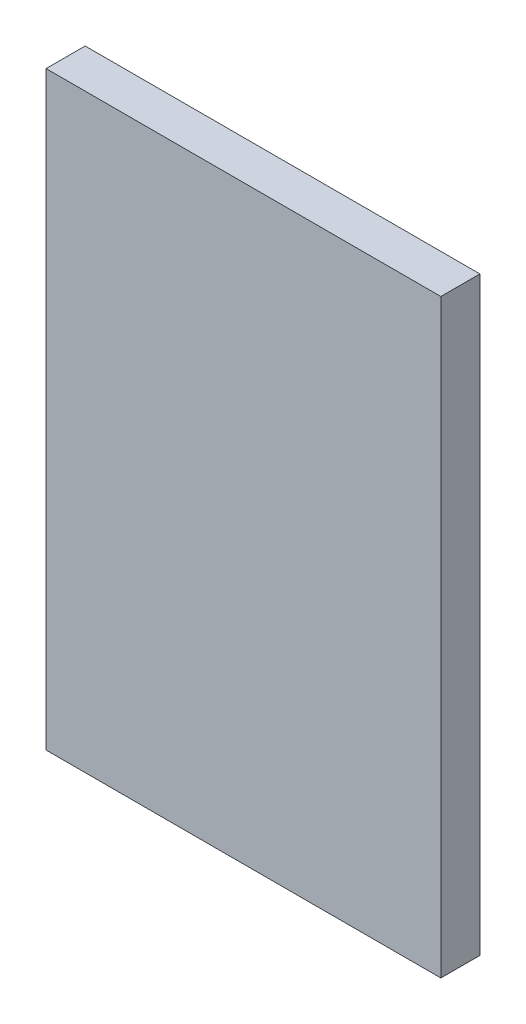
ISO-10303-21;
HEADER;
FILE_DESCRIPTION(('STEP AP214'),'2;1');
FILE_NAME('part.step','',(''),(''),'','','');
FILE_SCHEMA(('AUTOMOTIVE_DESIGN { 1 0 10303 214 1 1 1 1 }'));
ENDSEC;
DATA;
#1=APPLICATION_CONTEXT('core data for automotive mechanical design processes');
#2=APPLICATION_PROTOCOL_DEFINITION('international standard','automotive_design',2000,#1);
#3=PRODUCT_CONTEXT('',#1,'mechanical');
#4=PRODUCT('Part','Part','',(#3));
#5=PRODUCT_RELATED_PRODUCT_CATEGORY('part','',(#4));
#6=PRODUCT_DEFINITION_FORMATION('','',#4);
#7=PRODUCT_DEFINITION_CONTEXT('part definition',#1,'design');
#8=PRODUCT_DEFINITION('design','',#6,#7);
#9=PRODUCT_DEFINITION_SHAPE('','',#8);
#10=(LENGTH_UNIT() NAMED_UNIT(*) SI_UNIT(.MILLI.,.METRE.));
#11=(NAMED_UNIT(*) PLANE_ANGLE_UNIT() SI_UNIT($,.RADIAN.));
#12=(NAMED_UNIT(*) SI_UNIT($,.STERADIAN.) SOLID_ANGLE_UNIT());
#13=UNCERTAINTY_MEASURE_WITH_UNIT(LENGTH_MEASURE(1.E-05),#10,'distance_accuracy_value','');
#14=(GEOMETRIC_REPRESENTATION_CONTEXT(3) GLOBAL_UNCERTAINTY_ASSIGNED_CONTEXT((#13)) GLOBAL_UNIT_ASSIGNED_CONTEXT((#10,
#11,#12)) REPRESENTATION_CONTEXT('',''));
#15=CARTESIAN_POINT('',(0.,0.,0.));
#16=DIRECTION('',(0.,0.,1.));
#17=DIRECTION('',(1.,0.,0.));
#18=AXIS2_PLACEMENT_3D('',#15,#16,#17);
#19=CARTESIAN_POINT('',(0.,0.,1.));
#20=DIRECTION('',(0.,0.,1.));
#21=DIRECTION('',(1.,0.,0.));
#22=AXIS2_PLACEMENT_3D('',#19,#20,#21);
#23=PLANE('',#22);
#24=DIRECTION('',(1.,0.,0.));
#25=VECTOR('',#24,1.);
#26=CARTESIAN_POINT('',(5.05,7.55,1.));
#27=LINE('',#26,#25);
#28=CARTESIAN_POINT('',(-5.05,7.55,1.));
#29=VERTEX_POINT('',#28);
#30=CARTESIAN_POINT('',(5.05,7.55,1.));
#31=VERTEX_POINT('',#30);
#32=EDGE_CURVE('E68',#29,#31,#27,.T.);
#33=ORIENTED_EDGE('',*,*,#32,.F.);
#34=DIRECTION('',(0.,1.,0.));
#35=VECTOR('',#34,1.);
#36=CARTESIAN_POINT('',(-5.05,7.55,1.));
#37=LINE('',#36,#35);
#38=CARTESIAN_POINT('',(-5.05,-7.55,1.));
#39=VERTEX_POINT('',#38);
#40=EDGE_CURVE('E20',#39,#29,#37,.T.);
#41=ORIENTED_EDGE('',*,*,#40,.F.);
#42=DIRECTION('',(1.,0.,0.));
#43=VECTOR('',#42,1.);
#44=CARTESIAN_POINT('',(-5.05,-7.55,1.));
#45=LINE('',#44,#43);
#46=CARTESIAN_POINT('',(5.05,-7.55,1.));
#47=VERTEX_POINT('',#46);
#48=EDGE_CURVE('E58',#47,#39,#45,.F.);
#49=ORIENTED_EDGE('',*,*,#48,.F.);
#50=DIRECTION('',(0.,1.,0.));
#51=VECTOR('',#50,1.);
#52=CARTESIAN_POINT('',(5.05,-7.55,1.));
#53=LINE('',#52,#51);
#54=EDGE_CURVE('E53',#31,#47,#53,.F.);
#55=ORIENTED_EDGE('',*,*,#54,.F.);
#56=EDGE_LOOP('',(#33,#41,#49,#55));
#57=FACE_BOUND('',#56,.T.);
#58=ADVANCED_FACE('F17',(#57),#23,.T.);
#59=CARTESIAN_POINT('',(-5.05,7.55,0.));
#60=DIRECTION('',(-1.,0.,0.));
#61=DIRECTION('',(0.,0.,1.));
#62=AXIS2_PLACEMENT_3D('',#59,#60,#61);
#63=PLANE('',#62);
#64=DIRECTION('',(0.,0.,1.));
#65=VECTOR('',#64,1.);
#66=CARTESIAN_POINT('',(-5.05,7.55,0.));
#67=LINE('',#66,#65);
#68=CARTESIAN_POINT('',(-5.05,7.55,0.));
#69=VERTEX_POINT('',#68);
#70=EDGE_CURVE('E79',#69,#29,#67,.T.);
#71=ORIENTED_EDGE('',*,*,#70,.F.);
#72=DIRECTION('',(0.,1.,0.));
#73=VECTOR('',#72,1.);
#74=CARTESIAN_POINT('',(-5.05,0.,0.));
#75=LINE('',#74,#73);
#76=CARTESIAN_POINT('',(-5.05,-7.55,0.));
#77=VERTEX_POINT('',#76);
#78=EDGE_CURVE('E74',#69,#77,#75,.F.);
#79=ORIENTED_EDGE('',*,*,#78,.T.);
#80=DIRECTION('',(0.,0.,-1.));
#81=VECTOR('',#80,1.);
#82=CARTESIAN_POINT('',(-5.05,-7.55,0.));
#83=LINE('',#82,#81);
#84=EDGE_CURVE('E63',#39,#77,#83,.T.);
#85=ORIENTED_EDGE('',*,*,#84,.F.);
#86=ORIENTED_EDGE('',*,*,#40,.T.);
#87=EDGE_LOOP('',(#71,#79,#85,#86));
#88=FACE_BOUND('',#87,.T.);
#89=ADVANCED_FACE('F73',(#88),#63,.T.);
#90=CARTESIAN_POINT('',(-5.05,-7.55,0.));
#91=DIRECTION('',(0.,-1.,0.));
#92=DIRECTION('',(0.,0.,-1.));
#93=AXIS2_PLACEMENT_3D('',#90,#91,#92);
#94=PLANE('',#93);
#95=ORIENTED_EDGE('',*,*,#84,.T.);
#96=DIRECTION('',(1.,0.,0.));
#97=VECTOR('',#96,1.);
#98=CARTESIAN_POINT('',(0.,-7.55,0.));
#99=LINE('',#98,#97);
#100=CARTESIAN_POINT('',(5.05,-7.55,0.));
#101=VERTEX_POINT('',#100);
#102=EDGE_CURVE('E84',#77,#101,#99,.T.);
#103=ORIENTED_EDGE('',*,*,#102,.T.);
#104=DIRECTION('',(0.,0.,-1.));
#105=VECTOR('',#104,1.);
#106=CARTESIAN_POINT('',(5.05,-7.55,0.));
#107=LINE('',#106,#105);
#108=EDGE_CURVE('E65',#47,#101,#107,.T.);
#109=ORIENTED_EDGE('',*,*,#108,.F.);
#110=ORIENTED_EDGE('',*,*,#48,.T.);
#111=EDGE_LOOP('',(#95,#103,#109,#110));
#112=FACE_BOUND('',#111,.T.);
#113=ADVANCED_FACE('F60',(#112),#94,.T.);
#114=CARTESIAN_POINT('',(5.05,-7.55,0.));
#115=DIRECTION('',(1.,0.,0.));
#116=DIRECTION('',(0.,0.,-1.));
#117=AXIS2_PLACEMENT_3D('',#114,#115,#116);
#118=PLANE('',#117);
#119=ORIENTED_EDGE('',*,*,#108,.T.);
#120=DIRECTION('',(0.,1.,0.));
#121=VECTOR('',#120,1.);
#122=CARTESIAN_POINT('',(5.05,0.,0.));
#123=LINE('',#122,#121);
#124=CARTESIAN_POINT('',(5.05,7.55,0.));
#125=VERTEX_POINT('',#124);
#126=EDGE_CURVE('E26',#101,#125,#123,.T.);
#127=ORIENTED_EDGE('',*,*,#126,.T.);
#128=DIRECTION('',(0.,0.,1.));
#129=VECTOR('',#128,1.);
#130=CARTESIAN_POINT('',(5.05,7.55,0.));
#131=LINE('',#130,#129);
#132=EDGE_CURVE('E34',#31,#125,#131,.F.);
#133=ORIENTED_EDGE('',*,*,#132,.F.);
#134=ORIENTED_EDGE('',*,*,#54,.T.);
#135=EDGE_LOOP('',(#119,#127,#133,#134));
#136=FACE_BOUND('',#135,.T.);
#137=ADVANCED_FACE('F88',(#136),#118,.T.);
#138=CARTESIAN_POINT('',(5.05,7.55,0.));
#139=DIRECTION('',(0.,1.,0.));
#140=DIRECTION('',(0.,0.,1.));
#141=AXIS2_PLACEMENT_3D('',#138,#139,#140);
#142=PLANE('',#141);
#143=ORIENTED_EDGE('',*,*,#132,.T.);
#144=DIRECTION('',(1.,0.,0.));
#145=VECTOR('',#144,1.);
#146=CARTESIAN_POINT('',(0.,7.55,0.));
#147=LINE('',#146,#145);
#148=EDGE_CURVE('E11',#125,#69,#147,.F.);
#149=ORIENTED_EDGE('',*,*,#148,.T.);
#150=ORIENTED_EDGE('',*,*,#70,.T.);
#151=ORIENTED_EDGE('',*,*,#32,.T.);
#152=EDGE_LOOP('',(#143,#149,#150,#151));
#153=FACE_BOUND('',#152,.T.);
#154=ADVANCED_FACE('F91',(#153),#142,.T.);
#155=CARTESIAN_POINT('',(0.,0.,0.));
#156=DIRECTION('',(0.,0.,1.));
#157=DIRECTION('',(1.,0.,0.));
#158=AXIS2_PLACEMENT_3D('',#155,#156,#157);
#159=PLANE('',#158);
#160=ORIENTED_EDGE('',*,*,#126,.F.);
#161=ORIENTED_EDGE('',*,*,#102,.F.);
#162=ORIENTED_EDGE('',*,*,#78,.F.);
#163=ORIENTED_EDGE('',*,*,#148,.F.);
#164=EDGE_LOOP('',(#160,#161,#162,#163));
#165=FACE_BOUND('',#164,.T.);
#166=ADVANCED_FACE('F90',(#165),#159,.F.);
#167=CLOSED_SHELL('',(#58,#89,#113,#137,#154,#166));
#168=MANIFOLD_SOLID_BREP('B1',#167);
#169=ADVANCED_BREP_SHAPE_REPRESENTATION('',(#18,#168),#14);
#170=SHAPE_DEFINITION_REPRESENTATION(#9,#169);
ENDSEC;
END-ISO-10303-21;
